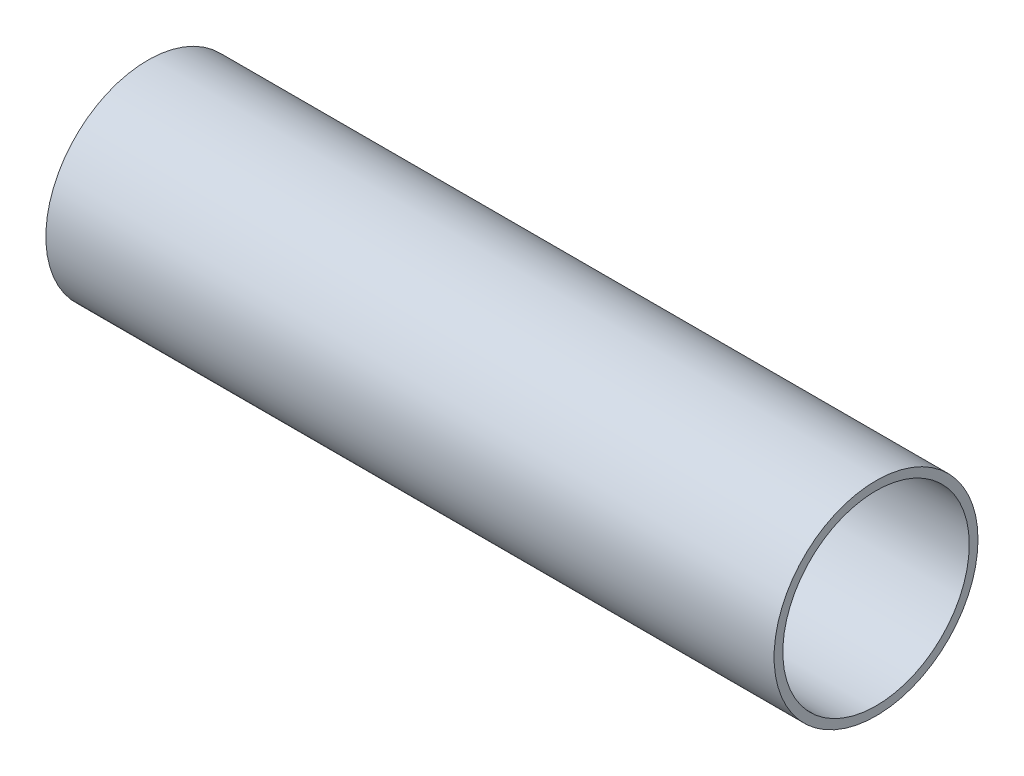
ISO-10303-21;
HEADER;
FILE_DESCRIPTION(('STEP AP214'),'2;1');
FILE_NAME('part.step','',(''),(''),'','','');
FILE_SCHEMA(('AUTOMOTIVE_DESIGN { 1 0 10303 214 1 1 1 1 }'));
ENDSEC;
DATA;
#1=APPLICATION_CONTEXT('core data for automotive mechanical design processes');
#2=APPLICATION_PROTOCOL_DEFINITION('international standard','automotive_design',2000,#1);
#3=PRODUCT_CONTEXT('',#1,'mechanical');
#4=PRODUCT('Part','Part','',(#3));
#5=PRODUCT_RELATED_PRODUCT_CATEGORY('part','',(#4));
#6=PRODUCT_DEFINITION_FORMATION('','',#4);
#7=PRODUCT_DEFINITION_CONTEXT('part definition',#1,'design');
#8=PRODUCT_DEFINITION('design','',#6,#7);
#9=PRODUCT_DEFINITION_SHAPE('','',#8);
#10=(LENGTH_UNIT() NAMED_UNIT(*) SI_UNIT(.MILLI.,.METRE.));
#11=(NAMED_UNIT(*) PLANE_ANGLE_UNIT() SI_UNIT($,.RADIAN.));
#12=(NAMED_UNIT(*) SI_UNIT($,.STERADIAN.) SOLID_ANGLE_UNIT());
#13=UNCERTAINTY_MEASURE_WITH_UNIT(LENGTH_MEASURE(1.E-05),#10,'distance_accuracy_value','');
#14=(GEOMETRIC_REPRESENTATION_CONTEXT(3) GLOBAL_UNCERTAINTY_ASSIGNED_CONTEXT((#13)) GLOBAL_UNIT_ASSIGNED_CONTEXT((#10,
#11,#12)) REPRESENTATION_CONTEXT('',''));
#15=CARTESIAN_POINT('',(0.,0.,0.));
#16=DIRECTION('',(0.,0.,1.));
#17=DIRECTION('',(1.,0.,0.));
#18=AXIS2_PLACEMENT_3D('',#15,#16,#17);
#19=CARTESIAN_POINT('',(250.,0.,0.));
#20=DIRECTION('',(1.,0.,0.));
#21=DIRECTION('',(0.,0.,-1.));
#22=AXIS2_PLACEMENT_3D('',#19,#20,#21);
#23=PLANE('',#22);
#24=CARTESIAN_POINT('',(250.,0.,0.));
#25=DIRECTION('',(1.,0.,0.));
#26=DIRECTION('',(0.,0.,-1.));
#27=AXIS2_PLACEMENT_3D('',#24,#25,#26);
#28=CIRCLE('',#27,35.);
#29=CARTESIAN_POINT('',(250.,0.,-35.));
#30=VERTEX_POINT('',#29);
#31=EDGE_CURVE('E10',#30,#30,#28,.T.);
#32=ORIENTED_EDGE('',*,*,#31,.T.);
#33=EDGE_LOOP('',(#32));
#34=FACE_BOUND('',#33,.T.);
#35=CARTESIAN_POINT('',(250.,0.,0.));
#36=DIRECTION('',(1.,0.,0.));
#37=DIRECTION('',(0.,0.,-1.));
#38=AXIS2_PLACEMENT_3D('',#35,#36,#37);
#39=CIRCLE('',#38,32.);
#40=CARTESIAN_POINT('',(250.,0.,-32.));
#41=VERTEX_POINT('',#40);
#42=EDGE_CURVE('E48',#41,#41,#39,.T.);
#43=ORIENTED_EDGE('',*,*,#42,.F.);
#44=EDGE_LOOP('',(#43));
#45=FACE_BOUND('',#44,.T.);
#46=ADVANCED_FACE('F37',(#34,#45),#23,.T.);
#47=CARTESIAN_POINT('',(0.,0.,0.));
#48=DIRECTION('',(1.,0.,0.));
#49=DIRECTION('',(0.,0.,-1.));
#50=AXIS2_PLACEMENT_3D('',#47,#48,#49);
#51=PLANE('',#50);
#52=CARTESIAN_POINT('',(0.,0.,0.));
#53=DIRECTION('',(1.,0.,0.));
#54=DIRECTION('',(0.,0.,-1.));
#55=AXIS2_PLACEMENT_3D('',#52,#53,#54);
#56=CIRCLE('',#55,35.);
#57=CARTESIAN_POINT('',(0.,0.,-35.));
#58=VERTEX_POINT('',#57);
#59=EDGE_CURVE('E41',#58,#58,#56,.T.);
#60=ORIENTED_EDGE('',*,*,#59,.F.);
#61=EDGE_LOOP('',(#60));
#62=FACE_BOUND('',#61,.T.);
#63=CARTESIAN_POINT('',(0.,0.,0.));
#64=DIRECTION('',(1.,0.,0.));
#65=DIRECTION('',(0.,0.,-1.));
#66=AXIS2_PLACEMENT_3D('',#63,#64,#65);
#67=CIRCLE('',#66,32.);
#68=CARTESIAN_POINT('',(0.,0.,-32.));
#69=VERTEX_POINT('',#68);
#70=EDGE_CURVE('E50',#69,#69,#67,.T.);
#71=ORIENTED_EDGE('',*,*,#70,.T.);
#72=EDGE_LOOP('',(#71));
#73=FACE_BOUND('',#72,.T.);
#74=ADVANCED_FACE('F60',(#62,#73),#51,.F.);
#75=CARTESIAN_POINT('',(250.,0.,0.));
#76=DIRECTION('',(-1.,0.,0.));
#77=DIRECTION('',(0.,0.,1.));
#78=AXIS2_PLACEMENT_3D('',#75,#76,#77);
#79=CYLINDRICAL_SURFACE('',#78,35.);
#80=ORIENTED_EDGE('',*,*,#31,.F.);
#81=EDGE_LOOP('',(#80));
#82=FACE_BOUND('',#81,.T.);
#83=ORIENTED_EDGE('',*,*,#59,.T.);
#84=EDGE_LOOP('',(#83));
#85=FACE_BOUND('',#84,.T.);
#86=ADVANCED_FACE('F39',(#82,#85),#79,.T.);
#87=CARTESIAN_POINT('',(250.,0.,0.));
#88=DIRECTION('',(-1.,0.,0.));
#89=DIRECTION('',(0.,0.,1.));
#90=AXIS2_PLACEMENT_3D('',#87,#88,#89);
#91=CYLINDRICAL_SURFACE('',#90,32.);
#92=ORIENTED_EDGE('',*,*,#42,.T.);
#93=EDGE_LOOP('',(#92));
#94=FACE_BOUND('',#93,.T.);
#95=ORIENTED_EDGE('',*,*,#70,.F.);
#96=EDGE_LOOP('',(#95));
#97=FACE_BOUND('',#96,.T.);
#98=ADVANCED_FACE('F56',(#94,#97),#91,.F.);
#99=CLOSED_SHELL('',(#46,#74,#86,#98));
#100=MANIFOLD_SOLID_BREP('B2',#99);
#101=ADVANCED_BREP_SHAPE_REPRESENTATION('',(#18,#100),#14);
#102=SHAPE_DEFINITION_REPRESENTATION(#9,#101);
ENDSEC;
END-ISO-10303-21;
